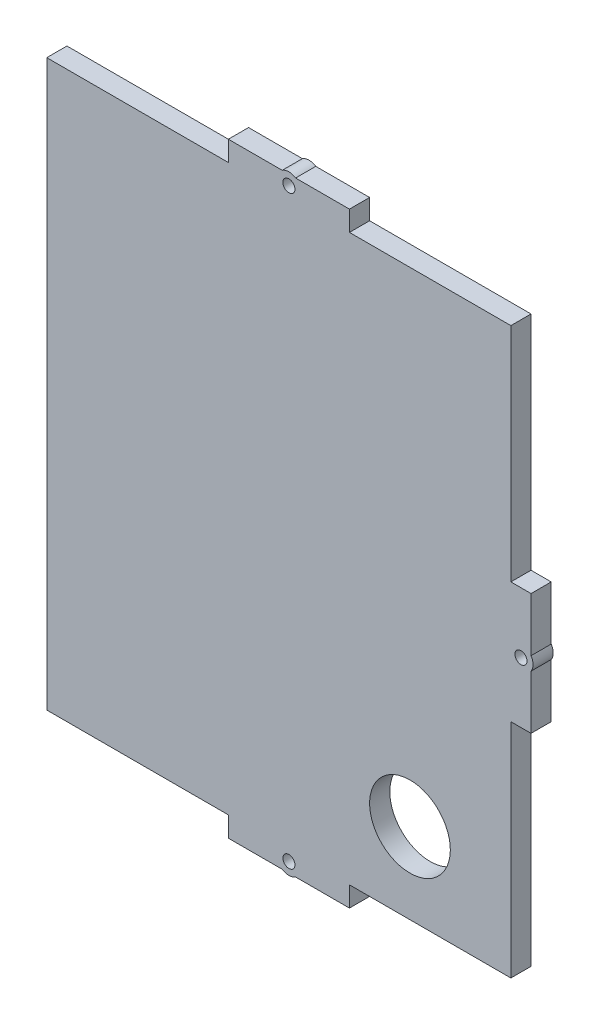
ISO-10303-21;
HEADER;
FILE_DESCRIPTION(('STEP AP214'),'2;1');
FILE_NAME('part.step','',(''),(''),'','','');
FILE_SCHEMA(('AUTOMOTIVE_DESIGN { 1 0 10303 214 1 1 1 1 }'));
ENDSEC;
DATA;
#1=APPLICATION_CONTEXT('core data for automotive mechanical design processes');
#2=APPLICATION_PROTOCOL_DEFINITION('international standard','automotive_design',2000,#1);
#3=PRODUCT_CONTEXT('',#1,'mechanical');
#4=PRODUCT('Part','Part','',(#3));
#5=PRODUCT_RELATED_PRODUCT_CATEGORY('part','',(#4));
#6=PRODUCT_DEFINITION_FORMATION('','',#4);
#7=PRODUCT_DEFINITION_CONTEXT('part definition',#1,'design');
#8=PRODUCT_DEFINITION('design','',#6,#7);
#9=PRODUCT_DEFINITION_SHAPE('','',#8);
#10=(LENGTH_UNIT() NAMED_UNIT(*) SI_UNIT(.MILLI.,.METRE.));
#11=(NAMED_UNIT(*) PLANE_ANGLE_UNIT() SI_UNIT($,.RADIAN.));
#12=(NAMED_UNIT(*) SI_UNIT($,.STERADIAN.) SOLID_ANGLE_UNIT());
#13=UNCERTAINTY_MEASURE_WITH_UNIT(LENGTH_MEASURE(1.E-05),#10,'distance_accuracy_value','');
#14=(GEOMETRIC_REPRESENTATION_CONTEXT(3) GLOBAL_UNCERTAINTY_ASSIGNED_CONTEXT((#13)) GLOBAL_UNIT_ASSIGNED_CONTEXT((#10,
#11,#12)) REPRESENTATION_CONTEXT('',''));
#15=CARTESIAN_POINT('',(0.,0.,0.));
#16=DIRECTION('',(0.,0.,1.));
#17=DIRECTION('',(1.,0.,0.));
#18=AXIS2_PLACEMENT_3D('',#15,#16,#17);
#19=CARTESIAN_POINT('',(55.,0.,5.));
#20=DIRECTION('',(1.,0.,0.));
#21=DIRECTION('',(0.,1.,0.));
#22=AXIS2_PLACEMENT_3D('',#19,#20,#21);
#23=PLANE('',#22);
#24=DIRECTION('',(0.,-1.,0.));
#25=VECTOR('',#24,1.);
#26=CARTESIAN_POINT('',(55.,0.,0.));
#27=LINE('',#26,#25);
#28=CARTESIAN_POINT('',(55.,70.,0.));
#29=VERTEX_POINT('',#28);
#30=CARTESIAN_POINT('',(55.,15.,0.));
#31=VERTEX_POINT('',#30);
#32=EDGE_CURVE('E233',#29,#31,#27,.T.);
#33=ORIENTED_EDGE('',*,*,#32,.F.);
#34=DIRECTION('',(0.,0.,-1.));
#35=VECTOR('',#34,1.);
#36=CARTESIAN_POINT('',(55.,70.,5.));
#37=LINE('',#36,#35);
#38=CARTESIAN_POINT('',(55.,70.,5.));
#39=VERTEX_POINT('',#38);
#40=EDGE_CURVE('E11',#39,#29,#37,.T.);
#41=ORIENTED_EDGE('',*,*,#40,.F.);
#42=DIRECTION('',(0.,-1.,0.));
#43=VECTOR('',#42,1.);
#44=CARTESIAN_POINT('',(55.,0.,5.));
#45=LINE('',#44,#43);
#46=CARTESIAN_POINT('',(55.,15.,5.));
#47=VERTEX_POINT('',#46);
#48=EDGE_CURVE('E315',#39,#47,#45,.T.);
#49=ORIENTED_EDGE('',*,*,#48,.T.);
#50=DIRECTION('',(0.,0.,-1.));
#51=VECTOR('',#50,1.);
#52=CARTESIAN_POINT('',(55.,15.,5.));
#53=LINE('',#52,#51);
#54=EDGE_CURVE('E135',#47,#31,#53,.T.);
#55=ORIENTED_EDGE('',*,*,#54,.T.);
#56=EDGE_LOOP('',(#33,#41,#49,#55));
#57=FACE_BOUND('',#56,.T.);
#58=ADVANCED_FACE('F45',(#57),#23,.T.);
#59=CARTESIAN_POINT('',(0.,70.,5.));
#60=DIRECTION('',(0.,1.,0.));
#61=DIRECTION('',(0.,0.,1.));
#62=AXIS2_PLACEMENT_3D('',#59,#60,#61);
#63=PLANE('',#62);
#64=DIRECTION('',(1.,0.,0.));
#65=VECTOR('',#64,1.);
#66=CARTESIAN_POINT('',(0.,70.,0.));
#67=LINE('',#66,#65);
#68=CARTESIAN_POINT('',(15.,70.,0.));
#69=VERTEX_POINT('',#68);
#70=EDGE_CURVE('E237',#69,#29,#67,.T.);
#71=ORIENTED_EDGE('',*,*,#70,.F.);
#72=DIRECTION('',(0.,0.,-1.));
#73=VECTOR('',#72,1.);
#74=CARTESIAN_POINT('',(15.,70.,5.));
#75=LINE('',#74,#73);
#76=CARTESIAN_POINT('',(15.,70.,5.));
#77=VERTEX_POINT('',#76);
#78=EDGE_CURVE('E56',#77,#69,#75,.T.);
#79=ORIENTED_EDGE('',*,*,#78,.F.);
#80=DIRECTION('',(1.,0.,0.));
#81=VECTOR('',#80,1.);
#82=CARTESIAN_POINT('',(0.,70.,5.));
#83=LINE('',#82,#81);
#84=EDGE_CURVE('E388',#77,#39,#83,.T.);
#85=ORIENTED_EDGE('',*,*,#84,.T.);
#86=ORIENTED_EDGE('',*,*,#40,.T.);
#87=EDGE_LOOP('',(#71,#79,#85,#86));
#88=FACE_BOUND('',#87,.T.);
#89=ADVANCED_FACE('F376',(#88),#63,.T.);
#90=CARTESIAN_POINT('',(15.,0.,5.));
#91=DIRECTION('',(1.,0.,0.));
#92=DIRECTION('',(0.,1.,0.));
#93=AXIS2_PLACEMENT_3D('',#90,#91,#92);
#94=PLANE('',#93);
#95=DIRECTION('',(0.,-1.,0.));
#96=VECTOR('',#95,1.);
#97=CARTESIAN_POINT('',(15.,0.,0.));
#98=LINE('',#97,#96);
#99=CARTESIAN_POINT('',(15.,75.,0.));
#100=VERTEX_POINT('',#99);
#101=EDGE_CURVE('E243',#100,#69,#98,.T.);
#102=ORIENTED_EDGE('',*,*,#101,.F.);
#103=DIRECTION('',(0.,0.,-1.));
#104=VECTOR('',#103,1.);
#105=CARTESIAN_POINT('',(15.,75.,5.));
#106=LINE('',#105,#104);
#107=CARTESIAN_POINT('',(15.,75.,5.));
#108=VERTEX_POINT('',#107);
#109=EDGE_CURVE('E363',#108,#100,#106,.T.);
#110=ORIENTED_EDGE('',*,*,#109,.F.);
#111=DIRECTION('',(0.,-1.,0.));
#112=VECTOR('',#111,1.);
#113=CARTESIAN_POINT('',(15.,0.,5.));
#114=LINE('',#113,#112);
#115=EDGE_CURVE('E372',#108,#77,#114,.T.);
#116=ORIENTED_EDGE('',*,*,#115,.T.);
#117=ORIENTED_EDGE('',*,*,#78,.T.);
#118=EDGE_LOOP('',(#102,#110,#116,#117));
#119=FACE_BOUND('',#118,.T.);
#120=ADVANCED_FACE('F47',(#119),#94,.T.);
#121=CARTESIAN_POINT('',(0.,75.,5.));
#122=DIRECTION('',(0.,1.,0.));
#123=DIRECTION('',(0.,0.,1.));
#124=AXIS2_PLACEMENT_3D('',#121,#122,#123);
#125=PLANE('',#124);
#126=DIRECTION('',(1.,0.,0.));
#127=VECTOR('',#126,1.);
#128=CARTESIAN_POINT('',(0.,75.,0.));
#129=LINE('',#128,#127);
#130=CARTESIAN_POINT('',(1.6583123951777,75.,0.));
#131=VERTEX_POINT('',#130);
#132=EDGE_CURVE('E248',#131,#100,#129,.T.);
#133=ORIENTED_EDGE('',*,*,#132,.F.);
#134=DIRECTION('',(0.,0.,-1.));
#135=VECTOR('',#134,1.);
#136=CARTESIAN_POINT('',(1.6583123951777,75.,5.));
#137=LINE('',#136,#135);
#138=CARTESIAN_POINT('',(1.6583123951777,75.,5.));
#139=VERTEX_POINT('',#138);
#140=EDGE_CURVE('E360',#139,#131,#137,.T.);
#141=ORIENTED_EDGE('',*,*,#140,.F.);
#142=DIRECTION('',(1.,0.,0.));
#143=VECTOR('',#142,1.);
#144=CARTESIAN_POINT('',(0.,75.,5.));
#145=LINE('',#144,#143);
#146=EDGE_CURVE('E387',#139,#108,#145,.T.);
#147=ORIENTED_EDGE('',*,*,#146,.T.);
#148=ORIENTED_EDGE('',*,*,#109,.T.);
#149=EDGE_LOOP('',(#133,#141,#147,#148));
#150=FACE_BOUND('',#149,.T.);
#151=ADVANCED_FACE('F383',(#150),#125,.T.);
#152=CARTESIAN_POINT('',(0.,72.5,5.));
#153=DIRECTION('',(0.,0.,-1.));
#154=DIRECTION('',(-1.,0.,0.));
#155=AXIS2_PLACEMENT_3D('',#152,#153,#154);
#156=CYLINDRICAL_SURFACE('',#155,3.);
#157=CARTESIAN_POINT('',(0.,72.5,0.));
#158=DIRECTION('',(0.,0.,1.));
#159=DIRECTION('',(1.,0.,0.));
#160=AXIS2_PLACEMENT_3D('',#157,#158,#159);
#161=CIRCLE('',#160,3.);
#162=CARTESIAN_POINT('',(-1.65831239517769,75.,0.));
#163=VERTEX_POINT('',#162);
#164=EDGE_CURVE('E252',#131,#163,#161,.T.);
#165=ORIENTED_EDGE('',*,*,#164,.T.);
#166=DIRECTION('',(0.,0.,-1.));
#167=VECTOR('',#166,1.);
#168=CARTESIAN_POINT('',(-1.65831239517769,75.,5.));
#169=LINE('',#168,#167);
#170=CARTESIAN_POINT('',(-1.65831239517769,75.,5.));
#171=VERTEX_POINT('',#170);
#172=EDGE_CURVE('E357',#171,#163,#169,.T.);
#173=ORIENTED_EDGE('',*,*,#172,.F.);
#174=CARTESIAN_POINT('',(0.,72.5,5.));
#175=DIRECTION('',(0.,0.,1.));
#176=DIRECTION('',(1.,0.,0.));
#177=AXIS2_PLACEMENT_3D('',#174,#175,#176);
#178=CIRCLE('',#177,3.);
#179=EDGE_CURVE('E393',#139,#171,#178,.T.);
#180=ORIENTED_EDGE('',*,*,#179,.F.);
#181=ORIENTED_EDGE('',*,*,#140,.T.);
#182=EDGE_LOOP('',(#165,#173,#180,#181));
#183=FACE_BOUND('',#182,.T.);
#184=ADVANCED_FACE('F507',(#183),#156,.T.);
#185=CARTESIAN_POINT('',(0.,75.,5.));
#186=DIRECTION('',(0.,1.,0.));
#187=DIRECTION('',(0.,0.,1.));
#188=AXIS2_PLACEMENT_3D('',#185,#186,#187);
#189=PLANE('',#188);
#190=DIRECTION('',(1.,0.,0.));
#191=VECTOR('',#190,1.);
#192=CARTESIAN_POINT('',(0.,75.,0.));
#193=LINE('',#192,#191);
#194=CARTESIAN_POINT('',(-15.,75.,0.));
#195=VERTEX_POINT('',#194);
#196=EDGE_CURVE('E256',#195,#163,#193,.T.);
#197=ORIENTED_EDGE('',*,*,#196,.F.);
#198=DIRECTION('',(0.,0.,-1.));
#199=VECTOR('',#198,1.);
#200=CARTESIAN_POINT('',(-15.,75.,5.));
#201=LINE('',#200,#199);
#202=CARTESIAN_POINT('',(-15.,75.,5.));
#203=VERTEX_POINT('',#202);
#204=EDGE_CURVE('E354',#203,#195,#201,.T.);
#205=ORIENTED_EDGE('',*,*,#204,.F.);
#206=DIRECTION('',(1.,0.,0.));
#207=VECTOR('',#206,1.);
#208=CARTESIAN_POINT('',(0.,75.,5.));
#209=LINE('',#208,#207);
#210=EDGE_CURVE('E401',#203,#171,#209,.T.);
#211=ORIENTED_EDGE('',*,*,#210,.T.);
#212=ORIENTED_EDGE('',*,*,#172,.T.);
#213=EDGE_LOOP('',(#197,#205,#211,#212));
#214=FACE_BOUND('',#213,.T.);
#215=ADVANCED_FACE('F503',(#214),#189,.T.);
#216=CARTESIAN_POINT('',(-15.,0.,5.));
#217=DIRECTION('',(1.,0.,0.));
#218=DIRECTION('',(0.,0.,-1.));
#219=AXIS2_PLACEMENT_3D('',#216,#217,#218);
#220=PLANE('',#219);
#221=DIRECTION('',(0.,-1.,0.));
#222=VECTOR('',#221,1.);
#223=CARTESIAN_POINT('',(-15.,0.,0.));
#224=LINE('',#223,#222);
#225=CARTESIAN_POINT('',(-15.,70.,0.));
#226=VERTEX_POINT('',#225);
#227=EDGE_CURVE('E260',#195,#226,#224,.T.);
#228=ORIENTED_EDGE('',*,*,#227,.T.);
#229=DIRECTION('',(0.,0.,-1.));
#230=VECTOR('',#229,1.);
#231=CARTESIAN_POINT('',(-15.,70.,5.));
#232=LINE('',#231,#230);
#233=CARTESIAN_POINT('',(-15.,70.,5.));
#234=VERTEX_POINT('',#233);
#235=EDGE_CURVE('E351',#234,#226,#232,.T.);
#236=ORIENTED_EDGE('',*,*,#235,.F.);
#237=DIRECTION('',(0.,-1.,0.));
#238=VECTOR('',#237,1.);
#239=CARTESIAN_POINT('',(-15.,0.,5.));
#240=LINE('',#239,#238);
#241=EDGE_CURVE('E405',#203,#234,#240,.T.);
#242=ORIENTED_EDGE('',*,*,#241,.F.);
#243=ORIENTED_EDGE('',*,*,#204,.T.);
#244=EDGE_LOOP('',(#228,#236,#242,#243));
#245=FACE_BOUND('',#244,.T.);
#246=ADVANCED_FACE('F499',(#245),#220,.F.);
#247=CARTESIAN_POINT('',(-60.,70.,0.));
#248=VERTEX_POINT('',#247);
#249=EDGE_CURVE('E244',#248,#226,#67,.T.);
#250=ORIENTED_EDGE('',*,*,#249,.F.);
#251=DIRECTION('',(0.,0.,-1.));
#252=VECTOR('',#251,1.);
#253=CARTESIAN_POINT('',(-60.,70.,5.));
#254=LINE('',#253,#252);
#255=CARTESIAN_POINT('',(-60.,70.,5.));
#256=VERTEX_POINT('',#255);
#257=EDGE_CURVE('E752',#256,#248,#254,.T.);
#258=ORIENTED_EDGE('',*,*,#257,.F.);
#259=EDGE_CURVE('E396',#256,#234,#83,.T.);
#260=ORIENTED_EDGE('',*,*,#259,.T.);
#261=ORIENTED_EDGE('',*,*,#235,.T.);
#262=EDGE_LOOP('',(#250,#258,#260,#261));
#263=FACE_BOUND('',#262,.T.);
#264=ADVANCED_FACE('F473',(#263),#63,.T.);
#265=CARTESIAN_POINT('',(0.,-70.,5.));
#266=DIRECTION('',(0.,1.,0.));
#267=DIRECTION('',(0.,0.,1.));
#268=AXIS2_PLACEMENT_3D('',#265,#266,#267);
#269=PLANE('',#268);
#270=DIRECTION('',(1.,0.,0.));
#271=VECTOR('',#270,1.);
#272=CARTESIAN_POINT('',(0.,-70.,0.));
#273=LINE('',#272,#271);
#274=CARTESIAN_POINT('',(-60.,-70.,0.));
#275=VERTEX_POINT('',#274);
#276=CARTESIAN_POINT('',(-15.,-70.,0.));
#277=VERTEX_POINT('',#276);
#278=EDGE_CURVE('E264',#275,#277,#273,.T.);
#279=ORIENTED_EDGE('',*,*,#278,.T.);
#280=DIRECTION('',(0.,0.,-1.));
#281=VECTOR('',#280,1.);
#282=CARTESIAN_POINT('',(-15.,-70.,5.));
#283=LINE('',#282,#281);
#284=CARTESIAN_POINT('',(-15.,-70.,5.));
#285=VERTEX_POINT('',#284);
#286=EDGE_CURVE('E348',#285,#277,#283,.T.);
#287=ORIENTED_EDGE('',*,*,#286,.F.);
#288=DIRECTION('',(1.,0.,0.));
#289=VECTOR('',#288,1.);
#290=CARTESIAN_POINT('',(0.,-70.,5.));
#291=LINE('',#290,#289);
#292=CARTESIAN_POINT('',(-60.,-70.,5.));
#293=VERTEX_POINT('',#292);
#294=EDGE_CURVE('E408',#293,#285,#291,.T.);
#295=ORIENTED_EDGE('',*,*,#294,.F.);
#296=DIRECTION('',(0.,0.,1.));
#297=VECTOR('',#296,1.);
#298=CARTESIAN_POINT('',(-60.,-70.,0.));
#299=LINE('',#298,#297);
#300=EDGE_CURVE('E763',#275,#293,#299,.T.);
#301=ORIENTED_EDGE('',*,*,#300,.F.);
#302=EDGE_LOOP('',(#279,#287,#295,#301));
#303=FACE_BOUND('',#302,.T.);
#304=ADVANCED_FACE('F478',(#303),#269,.F.);
#305=CARTESIAN_POINT('',(-15.,0.,5.));
#306=DIRECTION('',(-1.,0.,0.));
#307=DIRECTION('',(0.,0.,1.));
#308=AXIS2_PLACEMENT_3D('',#305,#306,#307);
#309=PLANE('',#308);
#310=DIRECTION('',(0.,1.,0.));
#311=VECTOR('',#310,1.);
#312=CARTESIAN_POINT('',(-15.,0.,0.));
#313=LINE('',#312,#311);
#314=CARTESIAN_POINT('',(-15.,-75.,0.));
#315=VERTEX_POINT('',#314);
#316=EDGE_CURVE('E268',#315,#277,#313,.T.);
#317=ORIENTED_EDGE('',*,*,#316,.F.);
#318=DIRECTION('',(0.,0.,-1.));
#319=VECTOR('',#318,1.);
#320=CARTESIAN_POINT('',(-15.,-75.,5.));
#321=LINE('',#320,#319);
#322=CARTESIAN_POINT('',(-15.,-75.,5.));
#323=VERTEX_POINT('',#322);
#324=EDGE_CURVE('E345',#323,#315,#321,.T.);
#325=ORIENTED_EDGE('',*,*,#324,.F.);
#326=DIRECTION('',(0.,1.,0.));
#327=VECTOR('',#326,1.);
#328=CARTESIAN_POINT('',(-15.,0.,5.));
#329=LINE('',#328,#327);
#330=EDGE_CURVE('E411',#323,#285,#329,.T.);
#331=ORIENTED_EDGE('',*,*,#330,.T.);
#332=ORIENTED_EDGE('',*,*,#286,.T.);
#333=EDGE_LOOP('',(#317,#325,#331,#332));
#334=FACE_BOUND('',#333,.T.);
#335=ADVANCED_FACE('F493',(#334),#309,.T.);
#336=CARTESIAN_POINT('',(0.,-75.,5.));
#337=DIRECTION('',(0.,1.,0.));
#338=DIRECTION('',(0.,0.,1.));
#339=AXIS2_PLACEMENT_3D('',#336,#337,#338);
#340=PLANE('',#339);
#341=DIRECTION('',(1.,0.,0.));
#342=VECTOR('',#341,1.);
#343=CARTESIAN_POINT('',(0.,-75.,0.));
#344=LINE('',#343,#342);
#345=CARTESIAN_POINT('',(-1.65831239517769,-75.,0.));
#346=VERTEX_POINT('',#345);
#347=EDGE_CURVE('E273',#315,#346,#344,.T.);
#348=ORIENTED_EDGE('',*,*,#347,.T.);
#349=DIRECTION('',(0.,0.,-1.));
#350=VECTOR('',#349,1.);
#351=CARTESIAN_POINT('',(-1.65831239517769,-75.,5.));
#352=LINE('',#351,#350);
#353=CARTESIAN_POINT('',(-1.65831239517769,-75.,5.));
#354=VERTEX_POINT('',#353);
#355=EDGE_CURVE('E342',#354,#346,#352,.T.);
#356=ORIENTED_EDGE('',*,*,#355,.F.);
#357=DIRECTION('',(1.,0.,0.));
#358=VECTOR('',#357,1.);
#359=CARTESIAN_POINT('',(0.,-75.,5.));
#360=LINE('',#359,#358);
#361=EDGE_CURVE('E416',#323,#354,#360,.T.);
#362=ORIENTED_EDGE('',*,*,#361,.F.);
#363=ORIENTED_EDGE('',*,*,#324,.T.);
#364=EDGE_LOOP('',(#348,#356,#362,#363));
#365=FACE_BOUND('',#364,.T.);
#366=ADVANCED_FACE('F489',(#365),#340,.F.);
#367=CARTESIAN_POINT('',(0.,-72.5,5.));
#368=DIRECTION('',(0.,0.,-1.));
#369=DIRECTION('',(-1.,0.,0.));
#370=AXIS2_PLACEMENT_3D('',#367,#368,#369);
#371=CYLINDRICAL_SURFACE('',#370,3.);
#372=CARTESIAN_POINT('',(0.,-72.5,0.));
#373=DIRECTION('',(0.,0.,1.));
#374=DIRECTION('',(1.,0.,0.));
#375=AXIS2_PLACEMENT_3D('',#372,#373,#374);
#376=CIRCLE('',#375,3.);
#377=CARTESIAN_POINT('',(1.6583123951777,-75.,0.));
#378=VERTEX_POINT('',#377);
#379=EDGE_CURVE('E277',#378,#346,#376,.F.);
#380=ORIENTED_EDGE('',*,*,#379,.F.);
#381=DIRECTION('',(0.,0.,-1.));
#382=VECTOR('',#381,1.);
#383=CARTESIAN_POINT('',(1.6583123951777,-75.,5.));
#384=LINE('',#383,#382);
#385=CARTESIAN_POINT('',(1.6583123951777,-75.,5.));
#386=VERTEX_POINT('',#385);
#387=EDGE_CURVE('E339',#386,#378,#384,.T.);
#388=ORIENTED_EDGE('',*,*,#387,.F.);
#389=CARTESIAN_POINT('',(0.,-72.5,5.));
#390=DIRECTION('',(0.,0.,1.));
#391=DIRECTION('',(1.,0.,0.));
#392=AXIS2_PLACEMENT_3D('',#389,#390,#391);
#393=CIRCLE('',#392,3.);
#394=EDGE_CURVE('E419',#386,#354,#393,.F.);
#395=ORIENTED_EDGE('',*,*,#394,.T.);
#396=ORIENTED_EDGE('',*,*,#355,.T.);
#397=EDGE_LOOP('',(#380,#388,#395,#396));
#398=FACE_BOUND('',#397,.T.);
#399=ADVANCED_FACE('F485',(#398),#371,.T.);
#400=CARTESIAN_POINT('',(0.,-75.,5.));
#401=DIRECTION('',(0.,1.,0.));
#402=DIRECTION('',(0.,0.,1.));
#403=AXIS2_PLACEMENT_3D('',#400,#401,#402);
#404=PLANE('',#403);
#405=DIRECTION('',(1.,0.,0.));
#406=VECTOR('',#405,1.);
#407=CARTESIAN_POINT('',(0.,-75.,0.));
#408=LINE('',#407,#406);
#409=CARTESIAN_POINT('',(15.,-75.,0.));
#410=VERTEX_POINT('',#409);
#411=EDGE_CURVE('E281',#378,#410,#408,.T.);
#412=ORIENTED_EDGE('',*,*,#411,.T.);
#413=DIRECTION('',(0.,0.,-1.));
#414=VECTOR('',#413,1.);
#415=CARTESIAN_POINT('',(15.,-75.,5.));
#416=LINE('',#415,#414);
#417=CARTESIAN_POINT('',(15.,-75.,5.));
#418=VERTEX_POINT('',#417);
#419=EDGE_CURVE('E335',#418,#410,#416,.T.);
#420=ORIENTED_EDGE('',*,*,#419,.F.);
#421=DIRECTION('',(1.,0.,0.));
#422=VECTOR('',#421,1.);
#423=CARTESIAN_POINT('',(0.,-75.,5.));
#424=LINE('',#423,#422);
#425=EDGE_CURVE('E423',#386,#418,#424,.T.);
#426=ORIENTED_EDGE('',*,*,#425,.F.);
#427=ORIENTED_EDGE('',*,*,#387,.T.);
#428=EDGE_LOOP('',(#412,#420,#426,#427));
#429=FACE_BOUND('',#428,.T.);
#430=ADVANCED_FACE('F481',(#429),#404,.F.);
#431=CARTESIAN_POINT('',(15.,0.,5.));
#432=DIRECTION('',(-1.,0.,0.));
#433=DIRECTION('',(0.,-1.,0.));
#434=AXIS2_PLACEMENT_3D('',#431,#432,#433);
#435=PLANE('',#434);
#436=DIRECTION('',(0.,1.,0.));
#437=VECTOR('',#436,1.);
#438=CARTESIAN_POINT('',(15.,0.,0.));
#439=LINE('',#438,#437);
#440=CARTESIAN_POINT('',(15.,-70.,0.));
#441=VERTEX_POINT('',#440);
#442=EDGE_CURVE('E284',#410,#441,#439,.T.);
#443=ORIENTED_EDGE('',*,*,#442,.T.);
#444=DIRECTION('',(0.,0.,-1.));
#445=VECTOR('',#444,1.);
#446=CARTESIAN_POINT('',(15.,-70.,5.));
#447=LINE('',#446,#445);
#448=CARTESIAN_POINT('',(15.,-70.,5.));
#449=VERTEX_POINT('',#448);
#450=EDGE_CURVE('E331',#449,#441,#447,.T.);
#451=ORIENTED_EDGE('',*,*,#450,.F.);
#452=DIRECTION('',(0.,1.,0.));
#453=VECTOR('',#452,1.);
#454=CARTESIAN_POINT('',(15.,0.,5.));
#455=LINE('',#454,#453);
#456=EDGE_CURVE('E426',#418,#449,#455,.T.);
#457=ORIENTED_EDGE('',*,*,#456,.F.);
#458=ORIENTED_EDGE('',*,*,#419,.T.);
#459=EDGE_LOOP('',(#443,#451,#457,#458));
#460=FACE_BOUND('',#459,.T.);
#461=ADVANCED_FACE('F477',(#460),#435,.F.);
#462=CARTESIAN_POINT('',(55.,-70.,0.));
#463=VERTEX_POINT('',#462);
#464=EDGE_CURVE('E269',#441,#463,#273,.T.);
#465=ORIENTED_EDGE('',*,*,#464,.T.);
#466=DIRECTION('',(0.,0.,-1.));
#467=VECTOR('',#466,1.);
#468=CARTESIAN_POINT('',(55.,-70.,5.));
#469=LINE('',#468,#467);
#470=CARTESIAN_POINT('',(55.,-70.,5.));
#471=VERTEX_POINT('',#470);
#472=EDGE_CURVE('E328',#471,#463,#469,.T.);
#473=ORIENTED_EDGE('',*,*,#472,.F.);
#474=EDGE_CURVE('E412',#449,#471,#291,.T.);
#475=ORIENTED_EDGE('',*,*,#474,.F.);
#476=ORIENTED_EDGE('',*,*,#450,.T.);
#477=EDGE_LOOP('',(#465,#473,#475,#476));
#478=FACE_BOUND('',#477,.T.);
#479=ADVANCED_FACE('F452',(#478),#269,.F.);
#480=CARTESIAN_POINT('',(55.,-15.,0.));
#481=VERTEX_POINT('',#480);
#482=EDGE_CURVE('E239',#481,#463,#27,.T.);
#483=ORIENTED_EDGE('',*,*,#482,.F.);
#484=DIRECTION('',(0.,0.,-1.));
#485=VECTOR('',#484,1.);
#486=CARTESIAN_POINT('',(55.,-15.,5.));
#487=LINE('',#486,#485);
#488=CARTESIAN_POINT('',(55.,-15.,5.));
#489=VERTEX_POINT('',#488);
#490=EDGE_CURVE('E325',#489,#481,#487,.T.);
#491=ORIENTED_EDGE('',*,*,#490,.F.);
#492=EDGE_CURVE('E432',#489,#471,#45,.T.);
#493=ORIENTED_EDGE('',*,*,#492,.T.);
#494=ORIENTED_EDGE('',*,*,#472,.T.);
#495=EDGE_LOOP('',(#483,#491,#493,#494));
#496=FACE_BOUND('',#495,.T.);
#497=ADVANCED_FACE('F456',(#496),#23,.T.);
#498=CARTESIAN_POINT('',(0.,-15.,5.));
#499=DIRECTION('',(0.,-1.,0.));
#500=DIRECTION('',(0.,0.,-1.));
#501=AXIS2_PLACEMENT_3D('',#498,#499,#500);
#502=PLANE('',#501);
#503=DIRECTION('',(-1.,0.,0.));
#504=VECTOR('',#503,1.);
#505=CARTESIAN_POINT('',(0.,-15.,0.));
#506=LINE('',#505,#504);
#507=CARTESIAN_POINT('',(60.,-15.,0.));
#508=VERTEX_POINT('',#507);
#509=EDGE_CURVE('E287',#508,#481,#506,.T.);
#510=ORIENTED_EDGE('',*,*,#509,.F.);
#511=DIRECTION('',(0.,0.,-1.));
#512=VECTOR('',#511,1.);
#513=CARTESIAN_POINT('',(60.,-15.,5.));
#514=LINE('',#513,#512);
#515=CARTESIAN_POINT('',(60.,-15.,5.));
#516=VERTEX_POINT('',#515);
#517=EDGE_CURVE('E322',#516,#508,#514,.T.);
#518=ORIENTED_EDGE('',*,*,#517,.F.);
#519=DIRECTION('',(-1.,0.,0.));
#520=VECTOR('',#519,1.);
#521=CARTESIAN_POINT('',(0.,-15.,5.));
#522=LINE('',#521,#520);
#523=EDGE_CURVE('E429',#516,#489,#522,.T.);
#524=ORIENTED_EDGE('',*,*,#523,.T.);
#525=ORIENTED_EDGE('',*,*,#490,.T.);
#526=EDGE_LOOP('',(#510,#518,#524,#525));
#527=FACE_BOUND('',#526,.T.);
#528=ADVANCED_FACE('F459',(#527),#502,.T.);
#529=CARTESIAN_POINT('',(60.,0.,5.));
#530=DIRECTION('',(1.,0.,0.));
#531=DIRECTION('',(0.,0.,-1.));
#532=AXIS2_PLACEMENT_3D('',#529,#530,#531);
#533=PLANE('',#532);
#534=DIRECTION('',(0.,-1.,0.));
#535=VECTOR('',#534,1.);
#536=CARTESIAN_POINT('',(60.,0.,0.));
#537=LINE('',#536,#535);
#538=CARTESIAN_POINT('',(60.,-1.65831239517766,0.));
#539=VERTEX_POINT('',#538);
#540=EDGE_CURVE('E291',#539,#508,#537,.T.);
#541=ORIENTED_EDGE('',*,*,#540,.F.);
#542=DIRECTION('',(0.,0.,-1.));
#543=VECTOR('',#542,1.);
#544=CARTESIAN_POINT('',(60.,-1.65831239517766,5.));
#545=LINE('',#544,#543);
#546=CARTESIAN_POINT('',(60.,-1.65831239517766,5.));
#547=VERTEX_POINT('',#546);
#548=EDGE_CURVE('E203',#547,#539,#545,.T.);
#549=ORIENTED_EDGE('',*,*,#548,.F.);
#550=DIRECTION('',(0.,-1.,0.));
#551=VECTOR('',#550,1.);
#552=CARTESIAN_POINT('',(60.,0.,5.));
#553=LINE('',#552,#551);
#554=EDGE_CURVE('E211',#547,#516,#553,.T.);
#555=ORIENTED_EDGE('',*,*,#554,.T.);
#556=ORIENTED_EDGE('',*,*,#517,.T.);
#557=EDGE_LOOP('',(#541,#549,#555,#556));
#558=FACE_BOUND('',#557,.T.);
#559=ADVANCED_FACE('F436',(#558),#533,.T.);
#560=CARTESIAN_POINT('',(57.5,0.,5.));
#561=DIRECTION('',(0.,0.,-1.));
#562=DIRECTION('',(-1.,0.,0.));
#563=AXIS2_PLACEMENT_3D('',#560,#561,#562);
#564=CYLINDRICAL_SURFACE('',#563,3.);
#565=CARTESIAN_POINT('',(57.5,0.,0.));
#566=DIRECTION('',(0.,0.,1.));
#567=DIRECTION('',(1.,0.,0.));
#568=AXIS2_PLACEMENT_3D('',#565,#566,#567);
#569=CIRCLE('',#568,3.);
#570=CARTESIAN_POINT('',(60.,1.65831239517773,0.));
#571=VERTEX_POINT('',#570);
#572=EDGE_CURVE('E197',#571,#539,#569,.F.);
#573=ORIENTED_EDGE('',*,*,#572,.F.);
#574=DIRECTION('',(0.,0.,-1.));
#575=VECTOR('',#574,1.);
#576=CARTESIAN_POINT('',(60.,1.65831239517773,5.));
#577=LINE('',#576,#575);
#578=CARTESIAN_POINT('',(60.,1.65831239517773,5.));
#579=VERTEX_POINT('',#578);
#580=EDGE_CURVE('E192',#579,#571,#577,.T.);
#581=ORIENTED_EDGE('',*,*,#580,.F.);
#582=CARTESIAN_POINT('',(57.5,0.,5.));
#583=DIRECTION('',(0.,0.,1.));
#584=DIRECTION('',(1.,0.,0.));
#585=AXIS2_PLACEMENT_3D('',#582,#583,#584);
#586=CIRCLE('',#585,3.);
#587=EDGE_CURVE('E195',#579,#547,#586,.F.);
#588=ORIENTED_EDGE('',*,*,#587,.T.);
#589=ORIENTED_EDGE('',*,*,#548,.T.);
#590=EDGE_LOOP('',(#573,#581,#588,#589));
#591=FACE_BOUND('',#590,.T.);
#592=ADVANCED_FACE('F194',(#591),#564,.T.);
#593=CARTESIAN_POINT('',(60.,0.,5.));
#594=DIRECTION('',(1.,0.,0.));
#595=DIRECTION('',(0.,0.,-1.));
#596=AXIS2_PLACEMENT_3D('',#593,#594,#595);
#597=PLANE('',#596);
#598=DIRECTION('',(0.,-1.,0.));
#599=VECTOR('',#598,1.);
#600=CARTESIAN_POINT('',(60.,0.,0.));
#601=LINE('',#600,#599);
#602=CARTESIAN_POINT('',(60.,15.,0.));
#603=VERTEX_POINT('',#602);
#604=EDGE_CURVE('E297',#603,#571,#601,.T.);
#605=ORIENTED_EDGE('',*,*,#604,.F.);
#606=DIRECTION('',(0.,0.,-1.));
#607=VECTOR('',#606,1.);
#608=CARTESIAN_POINT('',(60.,15.,5.));
#609=LINE('',#608,#607);
#610=CARTESIAN_POINT('',(60.,15.,5.));
#611=VERTEX_POINT('',#610);
#612=EDGE_CURVE('E128',#611,#603,#609,.T.);
#613=ORIENTED_EDGE('',*,*,#612,.F.);
#614=DIRECTION('',(0.,-1.,0.));
#615=VECTOR('',#614,1.);
#616=CARTESIAN_POINT('',(60.,0.,5.));
#617=LINE('',#616,#615);
#618=EDGE_CURVE('E208',#611,#579,#617,.T.);
#619=ORIENTED_EDGE('',*,*,#618,.T.);
#620=ORIENTED_EDGE('',*,*,#580,.T.);
#621=EDGE_LOOP('',(#605,#613,#619,#620));
#622=FACE_BOUND('',#621,.T.);
#623=ADVANCED_FACE('F214',(#622),#597,.T.);
#624=CARTESIAN_POINT('',(0.,72.5,5.));
#625=DIRECTION('',(0.,0.,-1.));
#626=DIRECTION('',(-1.,0.,0.));
#627=AXIS2_PLACEMENT_3D('',#624,#625,#626);
#628=CYLINDRICAL_SURFACE('',#627,1.5);
#629=CARTESIAN_POINT('',(0.,72.5,5.));
#630=DIRECTION('',(0.,0.,1.));
#631=DIRECTION('',(1.,0.,0.));
#632=AXIS2_PLACEMENT_3D('',#629,#630,#631);
#633=CIRCLE('',#632,1.5);
#634=CARTESIAN_POINT('',(1.50000000000001,72.5,5.));
#635=VERTEX_POINT('',#634);
#636=EDGE_CURVE('E225',#635,#635,#633,.T.);
#637=ORIENTED_EDGE('',*,*,#636,.T.);
#638=EDGE_LOOP('',(#637));
#639=FACE_BOUND('',#638,.T.);
#640=CARTESIAN_POINT('',(0.,72.5,0.));
#641=DIRECTION('',(0.,0.,1.));
#642=DIRECTION('',(1.,0.,0.));
#643=AXIS2_PLACEMENT_3D('',#640,#641,#642);
#644=CIRCLE('',#643,1.5);
#645=CARTESIAN_POINT('',(1.50000000000001,72.5,0.));
#646=VERTEX_POINT('',#645);
#647=EDGE_CURVE('E307',#646,#646,#644,.T.);
#648=ORIENTED_EDGE('',*,*,#647,.F.);
#649=EDGE_LOOP('',(#648));
#650=FACE_BOUND('',#649,.T.);
#651=ADVANCED_FACE('F643',(#639,#650),#628,.F.);
#652=CARTESIAN_POINT('',(0.,-72.5,5.));
#653=DIRECTION('',(0.,0.,-1.));
#654=DIRECTION('',(-1.,0.,0.));
#655=AXIS2_PLACEMENT_3D('',#652,#653,#654);
#656=CYLINDRICAL_SURFACE('',#655,1.5);
#657=CARTESIAN_POINT('',(0.,-72.5,5.));
#658=DIRECTION('',(0.,0.,1.));
#659=DIRECTION('',(1.,0.,0.));
#660=AXIS2_PLACEMENT_3D('',#657,#658,#659);
#661=CIRCLE('',#660,1.5);
#662=CARTESIAN_POINT('',(1.50000000000001,-72.5,5.));
#663=VERTEX_POINT('',#662);
#664=EDGE_CURVE('E218',#663,#663,#661,.F.);
#665=ORIENTED_EDGE('',*,*,#664,.F.);
#666=EDGE_LOOP('',(#665));
#667=FACE_BOUND('',#666,.T.);
#668=CARTESIAN_POINT('',(0.,-72.5,0.));
#669=DIRECTION('',(0.,0.,1.));
#670=DIRECTION('',(1.,0.,0.));
#671=AXIS2_PLACEMENT_3D('',#668,#669,#670);
#672=CIRCLE('',#671,1.5);
#673=CARTESIAN_POINT('',(1.50000000000001,-72.5,0.));
#674=VERTEX_POINT('',#673);
#675=EDGE_CURVE('E303',#674,#674,#672,.F.);
#676=ORIENTED_EDGE('',*,*,#675,.T.);
#677=EDGE_LOOP('',(#676));
#678=FACE_BOUND('',#677,.T.);
#679=ADVANCED_FACE('F651',(#667,#678),#656,.F.);
#680=CARTESIAN_POINT('',(0.,15.,5.));
#681=DIRECTION('',(0.,-1.,0.));
#682=DIRECTION('',(0.,0.,-1.));
#683=AXIS2_PLACEMENT_3D('',#680,#681,#682);
#684=PLANE('',#683);
#685=DIRECTION('',(-1.,0.,0.));
#686=VECTOR('',#685,1.);
#687=CARTESIAN_POINT('',(0.,15.,0.));
#688=LINE('',#687,#686);
#689=EDGE_CURVE('E300',#603,#31,#688,.T.);
#690=ORIENTED_EDGE('',*,*,#689,.T.);
#691=ORIENTED_EDGE('',*,*,#54,.F.);
#692=DIRECTION('',(-1.,0.,0.));
#693=VECTOR('',#692,1.);
#694=CARTESIAN_POINT('',(0.,15.,5.));
#695=LINE('',#694,#693);
#696=EDGE_CURVE('E64',#611,#47,#695,.T.);
#697=ORIENTED_EDGE('',*,*,#696,.F.);
#698=ORIENTED_EDGE('',*,*,#612,.T.);
#699=EDGE_LOOP('',(#690,#691,#697,#698));
#700=FACE_BOUND('',#699,.T.);
#701=ADVANCED_FACE('F438',(#700),#684,.F.);
#702=CARTESIAN_POINT('',(57.5,0.,5.));
#703=DIRECTION('',(0.,0.,-1.));
#704=DIRECTION('',(-1.,0.,0.));
#705=AXIS2_PLACEMENT_3D('',#702,#703,#704);
#706=CYLINDRICAL_SURFACE('',#705,1.5);
#707=CARTESIAN_POINT('',(57.5,0.,5.));
#708=DIRECTION('',(0.,0.,1.));
#709=DIRECTION('',(1.,0.,0.));
#710=AXIS2_PLACEMENT_3D('',#707,#708,#709);
#711=CIRCLE('',#710,1.5);
#712=CARTESIAN_POINT('',(59.,0.,5.));
#713=VERTEX_POINT('',#712);
#714=EDGE_CURVE('E229',#713,#713,#711,.F.);
#715=ORIENTED_EDGE('',*,*,#714,.F.);
#716=EDGE_LOOP('',(#715));
#717=FACE_BOUND('',#716,.T.);
#718=CARTESIAN_POINT('',(57.5,0.,0.));
#719=DIRECTION('',(0.,0.,1.));
#720=DIRECTION('',(1.,0.,0.));
#721=AXIS2_PLACEMENT_3D('',#718,#719,#720);
#722=CIRCLE('',#721,1.5);
#723=CARTESIAN_POINT('',(59.,0.,0.));
#724=VERTEX_POINT('',#723);
#725=EDGE_CURVE('E311',#724,#724,#722,.F.);
#726=ORIENTED_EDGE('',*,*,#725,.T.);
#727=EDGE_LOOP('',(#726));
#728=FACE_BOUND('',#727,.T.);
#729=ADVANCED_FACE('F668',(#717,#728),#706,.F.);
#730=CARTESIAN_POINT('',(0.,0.,5.));
#731=DIRECTION('',(0.,0.,1.));
#732=DIRECTION('',(1.,0.,0.));
#733=AXIS2_PLACEMENT_3D('',#730,#731,#732);
#734=PLANE('',#733);
#735=CARTESIAN_POINT('',(30.,-50.,5.));
#736=DIRECTION('',(0.,0.,1.));
#737=DIRECTION('',(1.,0.,0.));
#738=AXIS2_PLACEMENT_3D('',#735,#736,#737);
#739=CIRCLE('',#738,10.);
#740=CARTESIAN_POINT('',(40.,-50.,5.));
#741=VERTEX_POINT('',#740);
#742=EDGE_CURVE('E748',#741,#741,#739,.T.);
#743=ORIENTED_EDGE('',*,*,#742,.F.);
#744=EDGE_LOOP('',(#743));
#745=FACE_BOUND('',#744,.T.);
#746=ORIENTED_EDGE('',*,*,#48,.F.);
#747=ORIENTED_EDGE('',*,*,#84,.F.);
#748=ORIENTED_EDGE('',*,*,#115,.F.);
#749=ORIENTED_EDGE('',*,*,#146,.F.);
#750=ORIENTED_EDGE('',*,*,#179,.T.);
#751=ORIENTED_EDGE('',*,*,#210,.F.);
#752=ORIENTED_EDGE('',*,*,#241,.T.);
#753=ORIENTED_EDGE('',*,*,#259,.F.);
#754=DIRECTION('',(0.,1.,0.));
#755=VECTOR('',#754,1.);
#756=CARTESIAN_POINT('',(-60.,-70.,5.));
#757=LINE('',#756,#755);
#758=EDGE_CURVE('E238',#293,#256,#757,.T.);
#759=ORIENTED_EDGE('',*,*,#758,.F.);
#760=ORIENTED_EDGE('',*,*,#294,.T.);
#761=ORIENTED_EDGE('',*,*,#330,.F.);
#762=ORIENTED_EDGE('',*,*,#361,.T.);
#763=ORIENTED_EDGE('',*,*,#394,.F.);
#764=ORIENTED_EDGE('',*,*,#425,.T.);
#765=ORIENTED_EDGE('',*,*,#456,.T.);
#766=ORIENTED_EDGE('',*,*,#474,.T.);
#767=ORIENTED_EDGE('',*,*,#492,.F.);
#768=ORIENTED_EDGE('',*,*,#523,.F.);
#769=ORIENTED_EDGE('',*,*,#554,.F.);
#770=ORIENTED_EDGE('',*,*,#587,.F.);
#771=ORIENTED_EDGE('',*,*,#618,.F.);
#772=ORIENTED_EDGE('',*,*,#696,.T.);
#773=EDGE_LOOP('',(#746,#747,#748,#749,#750,#751,#752,#753,#759,#760,#761,#762,#763,#764,#765,
#766,#767,#768,#769,#770,#771,#772));
#774=FACE_BOUND('',#773,.T.);
#775=ORIENTED_EDGE('',*,*,#664,.T.);
#776=EDGE_LOOP('',(#775));
#777=FACE_BOUND('',#776,.T.);
#778=ORIENTED_EDGE('',*,*,#636,.F.);
#779=EDGE_LOOP('',(#778));
#780=FACE_BOUND('',#779,.T.);
#781=ORIENTED_EDGE('',*,*,#714,.T.);
#782=EDGE_LOOP('',(#781));
#783=FACE_BOUND('',#782,.T.);
#784=ADVANCED_FACE('F206',(#745,#774,#777,#780,#783),#734,.T.);
#785=CARTESIAN_POINT('',(0.,0.,0.));
#786=DIRECTION('',(0.,0.,1.));
#787=DIRECTION('',(1.,0.,0.));
#788=AXIS2_PLACEMENT_3D('',#785,#786,#787);
#789=PLANE('',#788);
#790=CARTESIAN_POINT('',(30.,-50.,0.));
#791=DIRECTION('',(0.,0.,1.));
#792=DIRECTION('',(1.,0.,0.));
#793=AXIS2_PLACEMENT_3D('',#790,#791,#792);
#794=CIRCLE('',#793,10.);
#795=CARTESIAN_POINT('',(40.,-50.,0.));
#796=VERTEX_POINT('',#795);
#797=EDGE_CURVE('E49',#796,#796,#794,.T.);
#798=ORIENTED_EDGE('',*,*,#797,.T.);
#799=EDGE_LOOP('',(#798));
#800=FACE_BOUND('',#799,.T.);
#801=ORIENTED_EDGE('',*,*,#32,.T.);
#802=ORIENTED_EDGE('',*,*,#689,.F.);
#803=ORIENTED_EDGE('',*,*,#604,.T.);
#804=ORIENTED_EDGE('',*,*,#572,.T.);
#805=ORIENTED_EDGE('',*,*,#540,.T.);
#806=ORIENTED_EDGE('',*,*,#509,.T.);
#807=ORIENTED_EDGE('',*,*,#482,.T.);
#808=ORIENTED_EDGE('',*,*,#464,.F.);
#809=ORIENTED_EDGE('',*,*,#442,.F.);
#810=ORIENTED_EDGE('',*,*,#411,.F.);
#811=ORIENTED_EDGE('',*,*,#379,.T.);
#812=ORIENTED_EDGE('',*,*,#347,.F.);
#813=ORIENTED_EDGE('',*,*,#316,.T.);
#814=ORIENTED_EDGE('',*,*,#278,.F.);
#815=DIRECTION('',(0.,-1.,0.));
#816=VECTOR('',#815,1.);
#817=CARTESIAN_POINT('',(-60.,70.,0.));
#818=LINE('',#817,#816);
#819=EDGE_CURVE('E756',#248,#275,#818,.T.);
#820=ORIENTED_EDGE('',*,*,#819,.F.);
#821=ORIENTED_EDGE('',*,*,#249,.T.);
#822=ORIENTED_EDGE('',*,*,#227,.F.);
#823=ORIENTED_EDGE('',*,*,#196,.T.);
#824=ORIENTED_EDGE('',*,*,#164,.F.);
#825=ORIENTED_EDGE('',*,*,#132,.T.);
#826=ORIENTED_EDGE('',*,*,#101,.T.);
#827=ORIENTED_EDGE('',*,*,#70,.T.);
#828=EDGE_LOOP('',(#801,#802,#803,#804,#805,#806,#807,#808,#809,#810,#811,#812,#813,#814,#820,
#821,#822,#823,#824,#825,#826,#827));
#829=FACE_BOUND('',#828,.T.);
#830=ORIENTED_EDGE('',*,*,#675,.F.);
#831=EDGE_LOOP('',(#830));
#832=FACE_BOUND('',#831,.T.);
#833=ORIENTED_EDGE('',*,*,#647,.T.);
#834=EDGE_LOOP('',(#833));
#835=FACE_BOUND('',#834,.T.);
#836=ORIENTED_EDGE('',*,*,#725,.F.);
#837=EDGE_LOOP('',(#836));
#838=FACE_BOUND('',#837,.T.);
#839=ADVANCED_FACE('F378',(#800,#829,#832,#835,#838),#789,.F.);
#840=CARTESIAN_POINT('',(-60.,0.,0.));
#841=DIRECTION('',(-1.,0.,0.));
#842=DIRECTION('',(0.,-1.,0.));
#843=AXIS2_PLACEMENT_3D('',#840,#841,#842);
#844=PLANE('',#843);
#845=ORIENTED_EDGE('',*,*,#257,.T.);
#846=ORIENTED_EDGE('',*,*,#819,.T.);
#847=ORIENTED_EDGE('',*,*,#300,.T.);
#848=ORIENTED_EDGE('',*,*,#758,.T.);
#849=EDGE_LOOP('',(#845,#846,#847,#848));
#850=FACE_BOUND('',#849,.T.);
#851=ADVANCED_FACE('F702',(#850),#844,.T.);
#852=CARTESIAN_POINT('',(30.,-50.,-5.));
#853=DIRECTION('',(0.,0.,1.));
#854=DIRECTION('',(1.,0.,0.));
#855=AXIS2_PLACEMENT_3D('',#852,#853,#854);
#856=CYLINDRICAL_SURFACE('',#855,10.);
#857=ORIENTED_EDGE('',*,*,#742,.T.);
#858=EDGE_LOOP('',(#857));
#859=FACE_BOUND('',#858,.T.);
#860=ORIENTED_EDGE('',*,*,#797,.F.);
#861=EDGE_LOOP('',(#860));
#862=FACE_BOUND('',#861,.T.);
#863=ADVANCED_FACE('F722',(#859,#862),#856,.F.);
#864=CLOSED_SHELL('',(#58,#89,#120,#151,#184,#215,#246,#264,#304,#335,#366,#399,#430,#461,#479,
#497,#528,#559,#592,#623,#651,#679,#701,#729,#784,#839,#851,#863));
#865=MANIFOLD_SOLID_BREP('B2',#864);
#866=ADVANCED_BREP_SHAPE_REPRESENTATION('',(#18,#865),#14);
#867=SHAPE_DEFINITION_REPRESENTATION(#9,#866);
ENDSEC;
END-ISO-10303-21;
